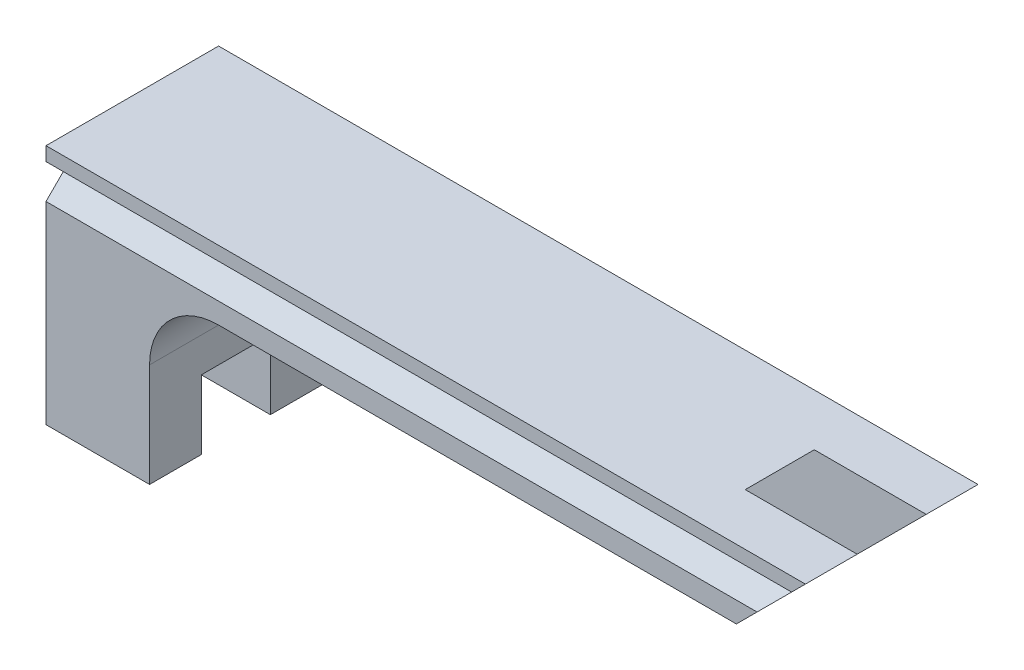
ISO-10303-21;
HEADER;
FILE_DESCRIPTION(('STEP AP214'),'2;1');
FILE_NAME('part.step','',(''),(''),'','','');
FILE_SCHEMA(('AUTOMOTIVE_DESIGN { 1 0 10303 214 1 1 1 1 }'));
ENDSEC;
DATA;
#1=APPLICATION_CONTEXT('core data for automotive mechanical design processes');
#2=APPLICATION_PROTOCOL_DEFINITION('international standard','automotive_design',2000,#1);
#3=PRODUCT_CONTEXT('',#1,'mechanical');
#4=PRODUCT('Part','Part','',(#3));
#5=PRODUCT_RELATED_PRODUCT_CATEGORY('part','',(#4));
#6=PRODUCT_DEFINITION_FORMATION('','',#4);
#7=PRODUCT_DEFINITION_CONTEXT('part definition',#1,'design');
#8=PRODUCT_DEFINITION('design','',#6,#7);
#9=PRODUCT_DEFINITION_SHAPE('','',#8);
#10=(LENGTH_UNIT() NAMED_UNIT(*) SI_UNIT(.MILLI.,.METRE.));
#11=(NAMED_UNIT(*) PLANE_ANGLE_UNIT() SI_UNIT($,.RADIAN.));
#12=(NAMED_UNIT(*) SI_UNIT($,.STERADIAN.) SOLID_ANGLE_UNIT());
#13=UNCERTAINTY_MEASURE_WITH_UNIT(LENGTH_MEASURE(1.E-05),#10,'distance_accuracy_value','');
#14=(GEOMETRIC_REPRESENTATION_CONTEXT(3) GLOBAL_UNCERTAINTY_ASSIGNED_CONTEXT((#13)) GLOBAL_UNIT_ASSIGNED_CONTEXT((#10,
#11,#12)) REPRESENTATION_CONTEXT('',''));
#15=CARTESIAN_POINT('',(0.,0.,0.));
#16=DIRECTION('',(0.,0.,1.));
#17=DIRECTION('',(1.,0.,0.));
#18=AXIS2_PLACEMENT_3D('',#15,#16,#17);
#19=CARTESIAN_POINT('',(-60.,-5.,40.));
#20=DIRECTION('',(0.,0.,1.));
#21=DIRECTION('',(1.,0.,0.));
#22=AXIS2_PLACEMENT_3D('',#19,#20,#21);
#23=PLANE('',#22);
#24=DIRECTION('',(1.,0.,0.));
#25=VECTOR('',#24,1.);
#26=CARTESIAN_POINT('',(-60.,21.,40.));
#27=LINE('',#26,#25);
#28=CARTESIAN_POINT('',(-110.,21.,40.));
#29=VERTEX_POINT('',#28);
#30=CARTESIAN_POINT('',(96.0000000000003,21.,40.));
#31=VERTEX_POINT('',#30);
#32=EDGE_CURVE('E11',#29,#31,#27,.T.);
#33=ORIENTED_EDGE('',*,*,#32,.F.);
#34=DIRECTION('',(0.,-1.,0.));
#35=VECTOR('',#34,1.);
#36=CARTESIAN_POINT('',(-110.,35.,40.));
#37=LINE('',#36,#35);
#38=CARTESIAN_POINT('',(-110.,-35.,40.));
#39=VERTEX_POINT('',#38);
#40=EDGE_CURVE('E259',#29,#39,#37,.T.);
#41=ORIENTED_EDGE('',*,*,#40,.T.);
#42=DIRECTION('',(1.,0.,0.));
#43=VECTOR('',#42,1.);
#44=CARTESIAN_POINT('',(-110.,-35.,40.));
#45=LINE('',#44,#43);
#46=CARTESIAN_POINT('',(-80.,-35.,40.));
#47=VERTEX_POINT('',#46);
#48=EDGE_CURVE('E263',#39,#47,#45,.T.);
#49=ORIENTED_EDGE('',*,*,#48,.T.);
#50=DIRECTION('',(0.,1.,0.));
#51=VECTOR('',#50,1.);
#52=CARTESIAN_POINT('',(-80.,-35.,40.));
#53=LINE('',#52,#51);
#54=CARTESIAN_POINT('',(-80.,-5.,40.));
#55=VERTEX_POINT('',#54);
#56=EDGE_CURVE('E266',#47,#55,#53,.T.);
#57=ORIENTED_EDGE('',*,*,#56,.T.);
#58=CARTESIAN_POINT('',(-60.,-5.,40.));
#59=DIRECTION('',(0.,0.,-1.));
#60=DIRECTION('',(1.,0.,0.));
#61=AXIS2_PLACEMENT_3D('',#58,#59,#60);
#62=CIRCLE('',#61,20.);
#63=CARTESIAN_POINT('',(-60.,15.,40.));
#64=VERTEX_POINT('',#63);
#65=EDGE_CURVE('E269',#55,#64,#62,.T.);
#66=ORIENTED_EDGE('',*,*,#65,.T.);
#67=DIRECTION('',(1.,0.,0.));
#68=VECTOR('',#67,1.);
#69=CARTESIAN_POINT('',(-60.,15.,40.));
#70=LINE('',#69,#68);
#71=CARTESIAN_POINT('',(90.0000000000003,15.,40.));
#72=VERTEX_POINT('',#71);
#73=EDGE_CURVE('E249',#64,#72,#70,.T.);
#74=ORIENTED_EDGE('',*,*,#73,.T.);
#75=DIRECTION('',(0.707106781186541,0.707106781186554,0.));
#76=VECTOR('',#75,1.);
#77=CARTESIAN_POINT('',(90.0000000000003,15.,40.));
#78=LINE('',#77,#76);
#79=EDGE_CURVE('E253',#72,#31,#78,.T.);
#80=ORIENTED_EDGE('',*,*,#79,.T.);
#81=EDGE_LOOP('',(#33,#41,#49,#57,#66,#74,#80));
#82=FACE_BOUND('',#81,.T.);
#83=ADVANCED_FACE('F35',(#82),#23,.T.);
#84=CARTESIAN_POINT('',(-60.,-5.,-10.));
#85=DIRECTION('',(0.,0.,-1.));
#86=DIRECTION('',(-1.,0.,0.));
#87=AXIS2_PLACEMENT_3D('',#84,#85,#86);
#88=PLANE('',#87);
#89=DIRECTION('',(1.,0.,0.));
#90=VECTOR('',#89,1.);
#91=CARTESIAN_POINT('',(-60.,31.,-10.));
#92=LINE('',#91,#90);
#93=CARTESIAN_POINT('',(-110.,31.,-10.));
#94=VERTEX_POINT('',#93);
#95=CARTESIAN_POINT('',(106.,31.,-10.));
#96=VERTEX_POINT('',#95);
#97=EDGE_CURVE('E209',#94,#96,#92,.T.);
#98=ORIENTED_EDGE('',*,*,#97,.F.);
#99=DIRECTION('',(0.,1.,0.));
#100=VECTOR('',#99,1.);
#101=CARTESIAN_POINT('',(-110.,-35.,-10.));
#102=LINE('',#101,#100);
#103=CARTESIAN_POINT('',(-110.,35.,-10.));
#104=VERTEX_POINT('',#103);
#105=EDGE_CURVE('E227',#94,#104,#102,.T.);
#106=ORIENTED_EDGE('',*,*,#105,.T.);
#107=DIRECTION('',(1.,0.,0.));
#108=VECTOR('',#107,1.);
#109=CARTESIAN_POINT('',(-110.,35.,-10.));
#110=LINE('',#109,#108);
#111=CARTESIAN_POINT('',(110.,35.,-10.));
#112=VERTEX_POINT('',#111);
#113=EDGE_CURVE('E226',#104,#112,#110,.T.);
#114=ORIENTED_EDGE('',*,*,#113,.T.);
#115=DIRECTION('',(-0.707106781186542,-0.707106781186553,0.));
#116=VECTOR('',#115,1.);
#117=CARTESIAN_POINT('',(110.,35.,-10.));
#118=LINE('',#117,#116);
#119=EDGE_CURVE('E237',#112,#96,#118,.T.);
#120=ORIENTED_EDGE('',*,*,#119,.T.);
#121=EDGE_LOOP('',(#98,#106,#114,#120));
#122=FACE_BOUND('',#121,.T.);
#123=ADVANCED_FACE('F370',(#122),#88,.T.);
#124=CARTESIAN_POINT('',(110.,77.4264068711929,5.00000000000001));
#125=DIRECTION('',(0.,0.,-1.));
#126=DIRECTION('',(0.,1.,0.));
#127=AXIS2_PLACEMENT_3D('',#124,#125,#126);
#128=PLANE('',#127);
#129=DIRECTION('',(0.707106781186552,0.707106781186544,0.));
#130=VECTOR('',#129,1.);
#131=CARTESIAN_POINT('',(115.,72.4264068711923,5.00000000000001));
#132=LINE('',#131,#130);
#133=CARTESIAN_POINT('',(57.5735931288071,15.,4.99999999999999));
#134=VERTEX_POINT('',#133);
#135=CARTESIAN_POINT('',(77.5735931288073,35.,4.99999999999999));
#136=VERTEX_POINT('',#135);
#137=EDGE_CURVE('E278',#134,#136,#132,.T.);
#138=ORIENTED_EDGE('',*,*,#137,.F.);
#139=DIRECTION('',(-1.,0.,0.));
#140=VECTOR('',#139,1.);
#141=CARTESIAN_POINT('',(-80.,15.,4.99999999999996));
#142=LINE('',#141,#140);
#143=CARTESIAN_POINT('',(90.0000000000003,15.,4.99999999999999));
#144=VERTEX_POINT('',#143);
#145=EDGE_CURVE('E290',#144,#134,#142,.T.);
#146=ORIENTED_EDGE('',*,*,#145,.F.);
#147=DIRECTION('',(-0.707106781186542,-0.707106781186553,0.));
#148=VECTOR('',#147,1.);
#149=CARTESIAN_POINT('',(110.,35.,5.));
#150=LINE('',#149,#148);
#151=CARTESIAN_POINT('',(110.,35.,5.));
#152=VERTEX_POINT('',#151);
#153=EDGE_CURVE('E344',#152,#144,#150,.T.);
#154=ORIENTED_EDGE('',*,*,#153,.F.);
#155=DIRECTION('',(1.,0.,0.));
#156=VECTOR('',#155,1.);
#157=CARTESIAN_POINT('',(-110.,35.,4.99999999999996));
#158=LINE('',#157,#156);
#159=EDGE_CURVE('E292',#136,#152,#158,.T.);
#160=ORIENTED_EDGE('',*,*,#159,.F.);
#161=EDGE_LOOP('',(#138,#146,#154,#160));
#162=FACE_BOUND('',#161,.T.);
#163=ADVANCED_FACE('F453',(#162),#128,.F.);
#164=CARTESIAN_POINT('',(110.,77.4264068711929,25.));
#165=DIRECTION('',(0.,0.,1.));
#166=DIRECTION('',(1.,0.,0.));
#167=AXIS2_PLACEMENT_3D('',#164,#165,#166);
#168=PLANE('',#167);
#169=DIRECTION('',(-0.707106781186552,-0.707106781186543,0.));
#170=VECTOR('',#169,1.);
#171=CARTESIAN_POINT('',(57.5735931288071,15.,25.));
#172=LINE('',#171,#170);
#173=CARTESIAN_POINT('',(77.5735931288073,35.,25.));
#174=VERTEX_POINT('',#173);
#175=CARTESIAN_POINT('',(57.5735931288071,15.,25.));
#176=VERTEX_POINT('',#175);
#177=EDGE_CURVE('E272',#174,#176,#172,.T.);
#178=ORIENTED_EDGE('',*,*,#177,.F.);
#179=DIRECTION('',(-1.,0.,0.));
#180=VECTOR('',#179,1.);
#181=CARTESIAN_POINT('',(-110.,35.,25.));
#182=LINE('',#181,#180);
#183=CARTESIAN_POINT('',(110.,35.,25.));
#184=VERTEX_POINT('',#183);
#185=EDGE_CURVE('E287',#184,#174,#182,.T.);
#186=ORIENTED_EDGE('',*,*,#185,.F.);
#187=DIRECTION('',(0.707106781186542,0.707106781186553,0.));
#188=VECTOR('',#187,1.);
#189=CARTESIAN_POINT('',(110.,35.,25.));
#190=LINE('',#189,#188);
#191=CARTESIAN_POINT('',(90.0000000000003,15.,25.));
#192=VERTEX_POINT('',#191);
#193=EDGE_CURVE('E341',#192,#184,#190,.T.);
#194=ORIENTED_EDGE('',*,*,#193,.F.);
#195=DIRECTION('',(1.,0.,0.));
#196=VECTOR('',#195,1.);
#197=CARTESIAN_POINT('',(-80.,15.,25.));
#198=LINE('',#197,#196);
#199=EDGE_CURVE('E284',#176,#192,#198,.T.);
#200=ORIENTED_EDGE('',*,*,#199,.F.);
#201=EDGE_LOOP('',(#178,#186,#194,#200));
#202=FACE_BOUND('',#201,.T.);
#203=ADVANCED_FACE('F471',(#202),#168,.F.);
#204=CARTESIAN_POINT('',(110.,35.,0.));
#205=DIRECTION('',(-0.707106781186553,0.707106781186542,0.));
#206=DIRECTION('',(-0.707106781186542,-0.707106781186553,0.));
#207=AXIS2_PLACEMENT_3D('',#204,#205,#206);
#208=PLANE('',#207);
#209=DIRECTION('',(0.577350269189619,0.577350269189629,0.577350269189629));
#210=VECTOR('',#209,1.);
#211=CARTESIAN_POINT('',(108.666666666667,33.6666666666666,2.66666666666666));
#212=LINE('',#211,#210);
#213=CARTESIAN_POINT('',(96.0000000000002,21.,-10.));
#214=VERTEX_POINT('',#213);
#215=CARTESIAN_POINT('',(101.,26.,-5.));
#216=VERTEX_POINT('',#215);
#217=EDGE_CURVE('E58',#214,#216,#212,.T.);
#218=ORIENTED_EDGE('',*,*,#217,.T.);
#219=DIRECTION('',(0.577350269189619,0.577350269189629,-0.577350269189629));
#220=VECTOR('',#219,1.);
#221=CARTESIAN_POINT('',(105.333333333333,30.3333333333333,-9.33333333333328));
#222=LINE('',#221,#220);
#223=EDGE_CURVE('E375',#216,#96,#222,.T.);
#224=ORIENTED_EDGE('',*,*,#223,.T.);
#225=ORIENTED_EDGE('',*,*,#119,.F.);
#226=DIRECTION('',(0.,0.,-1.));
#227=VECTOR('',#226,1.);
#228=CARTESIAN_POINT('',(110.,35.,30.));
#229=LINE('',#228,#227);
#230=EDGE_CURVE('E334',#152,#112,#229,.T.);
#231=ORIENTED_EDGE('',*,*,#230,.F.);
#232=ORIENTED_EDGE('',*,*,#153,.T.);
#233=DIRECTION('',(0.,0.,1.));
#234=VECTOR('',#233,1.);
#235=CARTESIAN_POINT('',(90.0000000000003,15.,0.));
#236=LINE('',#235,#234);
#237=CARTESIAN_POINT('',(90.0000000000003,15.,-10.));
#238=VERTEX_POINT('',#237);
#239=EDGE_CURVE('E295',#238,#144,#236,.T.);
#240=ORIENTED_EDGE('',*,*,#239,.F.);
#241=EDGE_CURVE('E230',#214,#238,#118,.T.);
#242=ORIENTED_EDGE('',*,*,#241,.F.);
#243=EDGE_LOOP('',(#218,#224,#225,#231,#232,#240,#242));
#244=FACE_BOUND('',#243,.T.);
#245=ADVANCED_FACE('F377',(#244),#208,.F.);
#246=CARTESIAN_POINT('',(-110.,-35.,30.));
#247=DIRECTION('',(0.,1.,0.));
#248=DIRECTION('',(0.,0.,1.));
#249=AXIS2_PLACEMENT_3D('',#246,#247,#248);
#250=PLANE('',#249);
#251=DIRECTION('',(0.,0.,-1.));
#252=VECTOR('',#251,1.);
#253=CARTESIAN_POINT('',(-110.,-35.,30.));
#254=LINE('',#253,#252);
#255=CARTESIAN_POINT('',(-110.,-35.,25.));
#256=VERTEX_POINT('',#255);
#257=EDGE_CURVE('E328',#39,#256,#254,.T.);
#258=ORIENTED_EDGE('',*,*,#257,.T.);
#259=DIRECTION('',(1.,0.,0.));
#260=VECTOR('',#259,1.);
#261=CARTESIAN_POINT('',(-110.,-35.,25.));
#262=LINE('',#261,#260);
#263=CARTESIAN_POINT('',(-80.,-35.,25.));
#264=VERTEX_POINT('',#263);
#265=EDGE_CURVE('E320',#256,#264,#262,.T.);
#266=ORIENTED_EDGE('',*,*,#265,.T.);
#267=DIRECTION('',(0.,0.,1.));
#268=VECTOR('',#267,1.);
#269=CARTESIAN_POINT('',(-80.,-35.,0.));
#270=LINE('',#269,#268);
#271=EDGE_CURVE('E323',#264,#47,#270,.T.);
#272=ORIENTED_EDGE('',*,*,#271,.T.);
#273=ORIENTED_EDGE('',*,*,#48,.F.);
#274=EDGE_LOOP('',(#258,#266,#272,#273));
#275=FACE_BOUND('',#274,.T.);
#276=ADVANCED_FACE('F502',(#275),#250,.F.);
#277=CARTESIAN_POINT('',(-110.,35.,30.));
#278=DIRECTION('',(0.,-1.,0.));
#279=DIRECTION('',(0.,0.,-1.));
#280=AXIS2_PLACEMENT_3D('',#277,#278,#279);
#281=PLANE('',#280);
#282=DIRECTION('',(0.,0.,1.));
#283=VECTOR('',#282,1.);
#284=CARTESIAN_POINT('',(77.5735931288074,35.,2.99999999999999));
#285=LINE('',#284,#283);
#286=EDGE_CURVE('E275',#136,#174,#285,.T.);
#287=ORIENTED_EDGE('',*,*,#286,.F.);
#288=ORIENTED_EDGE('',*,*,#159,.T.);
#289=ORIENTED_EDGE('',*,*,#230,.T.);
#290=ORIENTED_EDGE('',*,*,#113,.F.);
#291=DIRECTION('',(0.,0.,-1.));
#292=VECTOR('',#291,1.);
#293=CARTESIAN_POINT('',(-110.,35.,30.));
#294=LINE('',#293,#292);
#295=CARTESIAN_POINT('',(-110.,35.,40.));
#296=VERTEX_POINT('',#295);
#297=EDGE_CURVE('E331',#296,#104,#294,.T.);
#298=ORIENTED_EDGE('',*,*,#297,.F.);
#299=DIRECTION('',(-1.,0.,0.));
#300=VECTOR('',#299,1.);
#301=CARTESIAN_POINT('',(110.,35.,40.));
#302=LINE('',#301,#300);
#303=CARTESIAN_POINT('',(110.,35.,40.));
#304=VERTEX_POINT('',#303);
#305=EDGE_CURVE('E256',#304,#296,#302,.T.);
#306=ORIENTED_EDGE('',*,*,#305,.F.);
#307=EDGE_CURVE('E335',#304,#184,#229,.T.);
#308=ORIENTED_EDGE('',*,*,#307,.T.);
#309=ORIENTED_EDGE('',*,*,#185,.T.);
#310=EDGE_LOOP('',(#287,#288,#289,#290,#298,#306,#308,#309));
#311=FACE_BOUND('',#310,.T.);
#312=ADVANCED_FACE('F366',(#311),#281,.F.);
#313=CARTESIAN_POINT('',(-110.,35.,30.));
#314=DIRECTION('',(1.,0.,0.));
#315=DIRECTION('',(0.,0.,-1.));
#316=AXIS2_PLACEMENT_3D('',#313,#314,#315);
#317=PLANE('',#316);
#318=ORIENTED_EDGE('',*,*,#105,.F.);
#319=DIRECTION('',(0.,0.707106781186548,-0.707106781186548));
#320=VECTOR('',#319,1.);
#321=CARTESIAN_POINT('',(-110.,31.,-10.));
#322=LINE('',#321,#320);
#323=CARTESIAN_POINT('',(-110.,26.,-5.));
#324=VERTEX_POINT('',#323);
#325=EDGE_CURVE('E218',#324,#94,#322,.T.);
#326=ORIENTED_EDGE('',*,*,#325,.F.);
#327=DIRECTION('',(0.,0.707106781186547,0.707106781186548));
#328=VECTOR('',#327,1.);
#329=CARTESIAN_POINT('',(-110.,26.,-5.));
#330=LINE('',#329,#328);
#331=CARTESIAN_POINT('',(-110.,21.,-10.));
#332=VERTEX_POINT('',#331);
#333=EDGE_CURVE('E204',#332,#324,#330,.T.);
#334=ORIENTED_EDGE('',*,*,#333,.F.);
#335=CARTESIAN_POINT('',(-110.,-35.,-10.));
#336=VERTEX_POINT('',#335);
#337=EDGE_CURVE('E217',#336,#332,#102,.T.);
#338=ORIENTED_EDGE('',*,*,#337,.F.);
#339=CARTESIAN_POINT('',(-110.,-35.,5.));
#340=VERTEX_POINT('',#339);
#341=EDGE_CURVE('E327',#340,#336,#254,.T.);
#342=ORIENTED_EDGE('',*,*,#341,.F.);
#343=DIRECTION('',(0.,1.,0.));
#344=VECTOR('',#343,1.);
#345=CARTESIAN_POINT('',(-110.,-55.,5.));
#346=LINE('',#345,#344);
#347=CARTESIAN_POINT('',(-110.,-15.,5.));
#348=VERTEX_POINT('',#347);
#349=EDGE_CURVE('E302',#340,#348,#346,.T.);
#350=ORIENTED_EDGE('',*,*,#349,.T.);
#351=DIRECTION('',(0.,0.,1.));
#352=VECTOR('',#351,1.);
#353=CARTESIAN_POINT('',(-110.,-15.,5.));
#354=LINE('',#353,#352);
#355=CARTESIAN_POINT('',(-110.,-15.,25.));
#356=VERTEX_POINT('',#355);
#357=EDGE_CURVE('E306',#348,#356,#354,.T.);
#358=ORIENTED_EDGE('',*,*,#357,.T.);
#359=DIRECTION('',(0.,-1.,0.));
#360=VECTOR('',#359,1.);
#361=CARTESIAN_POINT('',(-110.,-55.,25.));
#362=LINE('',#361,#360);
#363=EDGE_CURVE('E299',#356,#256,#362,.T.);
#364=ORIENTED_EDGE('',*,*,#363,.T.);
#365=ORIENTED_EDGE('',*,*,#257,.F.);
#366=ORIENTED_EDGE('',*,*,#40,.F.);
#367=DIRECTION('',(0.,-0.707106781186547,0.707106781186548));
#368=VECTOR('',#367,1.);
#369=CARTESIAN_POINT('',(-110.,26.,35.));
#370=LINE('',#369,#368);
#371=CARTESIAN_POINT('',(-110.,26.,35.));
#372=VERTEX_POINT('',#371);
#373=EDGE_CURVE('E359',#372,#29,#370,.T.);
#374=ORIENTED_EDGE('',*,*,#373,.F.);
#375=DIRECTION('',(0.,-0.707106781186546,-0.707106781186548));
#376=VECTOR('',#375,1.);
#377=CARTESIAN_POINT('',(-110.,31.,40.));
#378=LINE('',#377,#376);
#379=CARTESIAN_POINT('',(-110.,31.,40.));
#380=VERTEX_POINT('',#379);
#381=EDGE_CURVE('E353',#380,#372,#378,.T.);
#382=ORIENTED_EDGE('',*,*,#381,.F.);
#383=EDGE_CURVE('E260',#296,#380,#37,.T.);
#384=ORIENTED_EDGE('',*,*,#383,.F.);
#385=ORIENTED_EDGE('',*,*,#297,.T.);
#386=EDGE_LOOP('',(#318,#326,#334,#338,#342,#350,#358,#364,#365,#366,#374,#382,#384,#385));
#387=FACE_BOUND('',#386,.T.);
#388=ADVANCED_FACE('F215',(#387),#317,.F.);
#389=CARTESIAN_POINT('',(-80.,-35.,-10.));
#390=VERTEX_POINT('',#389);
#391=CARTESIAN_POINT('',(-80.,-35.,5.));
#392=VERTEX_POINT('',#391);
#393=EDGE_CURVE('E324',#390,#392,#270,.T.);
#394=ORIENTED_EDGE('',*,*,#393,.T.);
#395=DIRECTION('',(-1.,0.,0.));
#396=VECTOR('',#395,1.);
#397=CARTESIAN_POINT('',(-110.,-35.,5.));
#398=LINE('',#397,#396);
#399=EDGE_CURVE('E315',#392,#340,#398,.T.);
#400=ORIENTED_EDGE('',*,*,#399,.T.);
#401=ORIENTED_EDGE('',*,*,#341,.T.);
#402=DIRECTION('',(-1.,0.,0.));
#403=VECTOR('',#402,1.);
#404=CARTESIAN_POINT('',(-80.,-35.,-10.));
#405=LINE('',#404,#403);
#406=EDGE_CURVE('E225',#390,#336,#405,.T.);
#407=ORIENTED_EDGE('',*,*,#406,.F.);
#408=EDGE_LOOP('',(#394,#400,#401,#407));
#409=FACE_BOUND('',#408,.T.);
#410=ADVANCED_FACE('F497',(#409),#250,.F.);
#411=CARTESIAN_POINT('',(-80.,-35.,0.));
#412=DIRECTION('',(-1.,0.,0.));
#413=DIRECTION('',(0.,0.,1.));
#414=AXIS2_PLACEMENT_3D('',#411,#412,#413);
#415=PLANE('',#414);
#416=ORIENTED_EDGE('',*,*,#393,.F.);
#417=DIRECTION('',(0.,-1.,0.));
#418=VECTOR('',#417,1.);
#419=CARTESIAN_POINT('',(-80.,-5.,-10.));
#420=LINE('',#419,#418);
#421=CARTESIAN_POINT('',(-80.,-5.,-10.));
#422=VERTEX_POINT('',#421);
#423=EDGE_CURVE('E246',#422,#390,#420,.T.);
#424=ORIENTED_EDGE('',*,*,#423,.F.);
#425=DIRECTION('',(0.,0.,1.));
#426=VECTOR('',#425,1.);
#427=CARTESIAN_POINT('',(-80.,-5.,30.));
#428=LINE('',#427,#426);
#429=EDGE_CURVE('E347',#422,#55,#428,.T.);
#430=ORIENTED_EDGE('',*,*,#429,.T.);
#431=ORIENTED_EDGE('',*,*,#56,.F.);
#432=ORIENTED_EDGE('',*,*,#271,.F.);
#433=DIRECTION('',(0.,-1.,0.));
#434=VECTOR('',#433,1.);
#435=CARTESIAN_POINT('',(-80.,-55.,25.));
#436=LINE('',#435,#434);
#437=CARTESIAN_POINT('',(-80.,-15.,25.));
#438=VERTEX_POINT('',#437);
#439=EDGE_CURVE('E298',#438,#264,#436,.T.);
#440=ORIENTED_EDGE('',*,*,#439,.F.);
#441=DIRECTION('',(0.,0.,1.));
#442=VECTOR('',#441,1.);
#443=CARTESIAN_POINT('',(-80.,-15.,5.));
#444=LINE('',#443,#442);
#445=CARTESIAN_POINT('',(-80.,-15.,5.));
#446=VERTEX_POINT('',#445);
#447=EDGE_CURVE('E303',#446,#438,#444,.T.);
#448=ORIENTED_EDGE('',*,*,#447,.F.);
#449=DIRECTION('',(0.,-1.,0.));
#450=VECTOR('',#449,1.);
#451=CARTESIAN_POINT('',(-80.,-35.,5.));
#452=LINE('',#451,#450);
#453=EDGE_CURVE('E338',#446,#392,#452,.T.);
#454=ORIENTED_EDGE('',*,*,#453,.T.);
#455=EDGE_LOOP('',(#416,#424,#430,#431,#432,#440,#448,#454));
#456=FACE_BOUND('',#455,.T.);
#457=ADVANCED_FACE('F494',(#456),#415,.F.);
#458=CARTESIAN_POINT('',(-80.,15.,0.));
#459=DIRECTION('',(0.,1.,0.));
#460=DIRECTION('',(-1.,0.,0.));
#461=AXIS2_PLACEMENT_3D('',#458,#459,#460);
#462=PLANE('',#461);
#463=DIRECTION('',(1.,0.,0.));
#464=VECTOR('',#463,1.);
#465=CARTESIAN_POINT('',(-47.5,15.,5.));
#466=LINE('',#465,#464);
#467=CARTESIAN_POINT('',(-47.5,15.,5.));
#468=VERTEX_POINT('',#467);
#469=CARTESIAN_POINT('',(37.5,15.,5.));
#470=VERTEX_POINT('',#469);
#471=EDGE_CURVE('E403',#468,#470,#466,.T.);
#472=ORIENTED_EDGE('',*,*,#471,.F.);
#473=CARTESIAN_POINT('',(-47.5,15.,15.));
#474=DIRECTION('',(0.,-1.,0.));
#475=DIRECTION('',(1.,0.,0.));
#476=AXIS2_PLACEMENT_3D('',#473,#474,#475);
#477=CIRCLE('',#476,10.);
#478=CARTESIAN_POINT('',(-47.5,15.,25.));
#479=VERTEX_POINT('',#478);
#480=EDGE_CURVE('E388',#479,#468,#477,.T.);
#481=ORIENTED_EDGE('',*,*,#480,.F.);
#482=DIRECTION('',(-1.,0.,0.));
#483=VECTOR('',#482,1.);
#484=CARTESIAN_POINT('',(-47.5,15.,25.));
#485=LINE('',#484,#483);
#486=CARTESIAN_POINT('',(37.5,15.,25.));
#487=VERTEX_POINT('',#486);
#488=EDGE_CURVE('E393',#487,#479,#485,.T.);
#489=ORIENTED_EDGE('',*,*,#488,.F.);
#490=CARTESIAN_POINT('',(37.5,15.,15.));
#491=DIRECTION('',(0.,-1.,0.));
#492=DIRECTION('',(1.,0.,0.));
#493=AXIS2_PLACEMENT_3D('',#490,#491,#492);
#494=CIRCLE('',#493,10.);
#495=EDGE_CURVE('E406',#470,#487,#494,.T.);
#496=ORIENTED_EDGE('',*,*,#495,.F.);
#497=EDGE_LOOP('',(#472,#481,#489,#496));
#498=FACE_BOUND('',#497,.T.);
#499=ORIENTED_EDGE('',*,*,#145,.T.);
#500=DIRECTION('',(0.,0.,-1.));
#501=VECTOR('',#500,1.);
#502=CARTESIAN_POINT('',(57.5735931288071,15.,25.));
#503=LINE('',#502,#501);
#504=EDGE_CURVE('E281',#176,#134,#503,.T.);
#505=ORIENTED_EDGE('',*,*,#504,.F.);
#506=ORIENTED_EDGE('',*,*,#199,.T.);
#507=EDGE_CURVE('E294',#192,#72,#236,.T.);
#508=ORIENTED_EDGE('',*,*,#507,.T.);
#509=ORIENTED_EDGE('',*,*,#73,.F.);
#510=DIRECTION('',(0.,0.,1.));
#511=VECTOR('',#510,1.);
#512=CARTESIAN_POINT('',(-60.,15.,0.));
#513=LINE('',#512,#511);
#514=CARTESIAN_POINT('',(-60.,15.,-10.));
#515=VERTEX_POINT('',#514);
#516=EDGE_CURVE('E210',#64,#515,#513,.F.);
#517=ORIENTED_EDGE('',*,*,#516,.T.);
#518=DIRECTION('',(-1.,0.,0.));
#519=VECTOR('',#518,1.);
#520=CARTESIAN_POINT('',(90.0000000000003,15.,-10.));
#521=LINE('',#520,#519);
#522=EDGE_CURVE('E240',#238,#515,#521,.T.);
#523=ORIENTED_EDGE('',*,*,#522,.F.);
#524=ORIENTED_EDGE('',*,*,#239,.T.);
#525=EDGE_LOOP('',(#499,#505,#506,#508,#509,#517,#523,#524));
#526=FACE_BOUND('',#525,.T.);
#527=ADVANCED_FACE('F426',(#498,#526),#462,.F.);
#528=CARTESIAN_POINT('',(-110.,-55.,25.));
#529=DIRECTION('',(0.,0.,1.));
#530=DIRECTION('',(1.,0.,0.));
#531=AXIS2_PLACEMENT_3D('',#528,#529,#530);
#532=PLANE('',#531);
#533=ORIENTED_EDGE('',*,*,#363,.F.);
#534=DIRECTION('',(1.,0.,0.));
#535=VECTOR('',#534,1.);
#536=CARTESIAN_POINT('',(-110.,-15.,25.));
#537=LINE('',#536,#535);
#538=EDGE_CURVE('E313',#356,#438,#537,.T.);
#539=ORIENTED_EDGE('',*,*,#538,.T.);
#540=ORIENTED_EDGE('',*,*,#439,.T.);
#541=ORIENTED_EDGE('',*,*,#265,.F.);
#542=EDGE_LOOP('',(#533,#539,#540,#541));
#543=FACE_BOUND('',#542,.T.);
#544=ADVANCED_FACE('F487',(#543),#532,.F.);
#545=CARTESIAN_POINT('',(-110.,-55.,5.));
#546=DIRECTION('',(0.,0.,-1.));
#547=DIRECTION('',(-1.,0.,0.));
#548=AXIS2_PLACEMENT_3D('',#545,#546,#547);
#549=PLANE('',#548);
#550=ORIENTED_EDGE('',*,*,#453,.F.);
#551=DIRECTION('',(1.,0.,0.));
#552=VECTOR('',#551,1.);
#553=CARTESIAN_POINT('',(-110.,-15.,5.));
#554=LINE('',#553,#552);
#555=EDGE_CURVE('E309',#348,#446,#554,.T.);
#556=ORIENTED_EDGE('',*,*,#555,.F.);
#557=ORIENTED_EDGE('',*,*,#349,.F.);
#558=ORIENTED_EDGE('',*,*,#399,.F.);
#559=EDGE_LOOP('',(#550,#556,#557,#558));
#560=FACE_BOUND('',#559,.T.);
#561=ADVANCED_FACE('F483',(#560),#549,.F.);
#562=CARTESIAN_POINT('',(-110.,-15.,5.));
#563=DIRECTION('',(0.,1.,0.));
#564=DIRECTION('',(0.,0.,1.));
#565=AXIS2_PLACEMENT_3D('',#562,#563,#564);
#566=PLANE('',#565);
#567=ORIENTED_EDGE('',*,*,#447,.T.);
#568=ORIENTED_EDGE('',*,*,#538,.F.);
#569=ORIENTED_EDGE('',*,*,#357,.F.);
#570=ORIENTED_EDGE('',*,*,#555,.T.);
#571=EDGE_LOOP('',(#567,#568,#569,#570));
#572=FACE_BOUND('',#571,.T.);
#573=ADVANCED_FACE('F479',(#572),#566,.F.);
#574=DIRECTION('',(-0.577350269189619,-0.577350269189629,-0.57735026918963));
#575=VECTOR('',#574,1.);
#576=CARTESIAN_POINT('',(95.3333333333334,20.3333333333331,29.3333333333331));
#577=LINE('',#576,#575);
#578=CARTESIAN_POINT('',(106.,31.,40.));
#579=VERTEX_POINT('',#578);
#580=CARTESIAN_POINT('',(101.,26.,35.));
#581=VERTEX_POINT('',#580);
#582=EDGE_CURVE('E50',#579,#581,#577,.T.);
#583=ORIENTED_EDGE('',*,*,#582,.T.);
#584=DIRECTION('',(-0.577350269189619,-0.577350269189629,0.57735026918963));
#585=VECTOR('',#584,1.);
#586=CARTESIAN_POINT('',(118.666666666667,43.6666666666668,17.3333333333332));
#587=LINE('',#586,#585);
#588=EDGE_CURVE('E380',#581,#31,#587,.T.);
#589=ORIENTED_EDGE('',*,*,#588,.T.);
#590=ORIENTED_EDGE('',*,*,#79,.F.);
#591=ORIENTED_EDGE('',*,*,#507,.F.);
#592=ORIENTED_EDGE('',*,*,#193,.T.);
#593=ORIENTED_EDGE('',*,*,#307,.F.);
#594=EDGE_CURVE('E252',#579,#304,#78,.T.);
#595=ORIENTED_EDGE('',*,*,#594,.F.);
#596=EDGE_LOOP('',(#583,#589,#590,#591,#592,#593,#595));
#597=FACE_BOUND('',#596,.T.);
#598=ADVANCED_FACE('F468',(#597),#208,.F.);
#599=CARTESIAN_POINT('',(-60.,-5.,0.));
#600=DIRECTION('',(0.,0.,-1.));
#601=DIRECTION('',(-1.,0.,0.));
#602=AXIS2_PLACEMENT_3D('',#599,#600,#601);
#603=CYLINDRICAL_SURFACE('',#602,20.);
#604=ORIENTED_EDGE('',*,*,#429,.F.);
#605=CARTESIAN_POINT('',(-60.,-5.,-10.));
#606=DIRECTION('',(0.,0.,1.));
#607=DIRECTION('',(-1.,0.,0.));
#608=AXIS2_PLACEMENT_3D('',#605,#606,#607);
#609=CIRCLE('',#608,20.);
#610=EDGE_CURVE('E243',#515,#422,#609,.T.);
#611=ORIENTED_EDGE('',*,*,#610,.F.);
#612=ORIENTED_EDGE('',*,*,#516,.F.);
#613=ORIENTED_EDGE('',*,*,#65,.F.);
#614=EDGE_LOOP('',(#604,#611,#612,#613));
#615=FACE_BOUND('',#614,.T.);
#616=ADVANCED_FACE('F37',(#615),#603,.F.);
#617=CARTESIAN_POINT('',(57.5735931288071,15.,2.99999999999999));
#618=DIRECTION('',(-0.707106781186544,0.707106781186552,0.));
#619=DIRECTION('',(-0.707106781186552,-0.707106781186544,0.));
#620=AXIS2_PLACEMENT_3D('',#617,#618,#619);
#621=PLANE('',#620);
#622=ORIENTED_EDGE('',*,*,#504,.T.);
#623=ORIENTED_EDGE('',*,*,#137,.T.);
#624=ORIENTED_EDGE('',*,*,#286,.T.);
#625=ORIENTED_EDGE('',*,*,#177,.T.);
#626=EDGE_LOOP('',(#622,#623,#624,#625));
#627=FACE_BOUND('',#626,.T.);
#628=ADVANCED_FACE('F457',(#627),#621,.F.);
#629=DIRECTION('',(-1.,0.,0.));
#630=VECTOR('',#629,1.);
#631=CARTESIAN_POINT('',(-60.,31.,40.));
#632=LINE('',#631,#630);
#633=EDGE_CURVE('E43',#579,#380,#632,.T.);
#634=ORIENTED_EDGE('',*,*,#633,.F.);
#635=ORIENTED_EDGE('',*,*,#594,.T.);
#636=ORIENTED_EDGE('',*,*,#305,.T.);
#637=ORIENTED_EDGE('',*,*,#383,.T.);
#638=EDGE_LOOP('',(#634,#635,#636,#637));
#639=FACE_BOUND('',#638,.T.);
#640=ADVANCED_FACE('F361',(#639),#23,.T.);
#641=DIRECTION('',(-1.,0.,0.));
#642=VECTOR('',#641,1.);
#643=CARTESIAN_POINT('',(-60.,21.,-10.));
#644=LINE('',#643,#642);
#645=EDGE_CURVE('E201',#214,#332,#644,.T.);
#646=ORIENTED_EDGE('',*,*,#645,.F.);
#647=ORIENTED_EDGE('',*,*,#241,.T.);
#648=ORIENTED_EDGE('',*,*,#522,.T.);
#649=ORIENTED_EDGE('',*,*,#610,.T.);
#650=ORIENTED_EDGE('',*,*,#423,.T.);
#651=ORIENTED_EDGE('',*,*,#406,.T.);
#652=ORIENTED_EDGE('',*,*,#337,.T.);
#653=EDGE_LOOP('',(#646,#647,#648,#649,#650,#651,#652));
#654=FACE_BOUND('',#653,.T.);
#655=ADVANCED_FACE('F222',(#654),#88,.T.);
#656=CARTESIAN_POINT('',(-47.5,25.,15.));
#657=DIRECTION('',(0.,-1.,0.));
#658=DIRECTION('',(1.,0.,0.));
#659=AXIS2_PLACEMENT_3D('',#656,#657,#658);
#660=CYLINDRICAL_SURFACE('',#659,10.);
#661=ORIENTED_EDGE('',*,*,#480,.T.);
#662=DIRECTION('',(0.,-1.,0.));
#663=VECTOR('',#662,1.);
#664=CARTESIAN_POINT('',(-47.5,25.,5.));
#665=LINE('',#664,#663);
#666=CARTESIAN_POINT('',(-47.5,25.,5.));
#667=VERTEX_POINT('',#666);
#668=EDGE_CURVE('E234',#667,#468,#665,.T.);
#669=ORIENTED_EDGE('',*,*,#668,.F.);
#670=CARTESIAN_POINT('',(-47.5,25.,15.));
#671=DIRECTION('',(0.,-1.,0.));
#672=DIRECTION('',(1.,0.,0.));
#673=AXIS2_PLACEMENT_3D('',#670,#671,#672);
#674=CIRCLE('',#673,10.);
#675=CARTESIAN_POINT('',(-47.5,25.,25.));
#676=VERTEX_POINT('',#675);
#677=EDGE_CURVE('E389',#676,#667,#674,.T.);
#678=ORIENTED_EDGE('',*,*,#677,.F.);
#679=DIRECTION('',(0.,-1.,0.));
#680=VECTOR('',#679,1.);
#681=CARTESIAN_POINT('',(-47.5,25.,25.));
#682=LINE('',#681,#680);
#683=EDGE_CURVE('E232',#676,#479,#682,.T.);
#684=ORIENTED_EDGE('',*,*,#683,.T.);
#685=EDGE_LOOP('',(#661,#669,#678,#684));
#686=FACE_BOUND('',#685,.T.);
#687=ADVANCED_FACE('F435',(#686),#660,.F.);
#688=CARTESIAN_POINT('',(-47.5,25.,25.));
#689=DIRECTION('',(0.,0.,1.));
#690=DIRECTION('',(1.,0.,0.));
#691=AXIS2_PLACEMENT_3D('',#688,#689,#690);
#692=PLANE('',#691);
#693=ORIENTED_EDGE('',*,*,#488,.T.);
#694=ORIENTED_EDGE('',*,*,#683,.F.);
#695=DIRECTION('',(-1.,0.,0.));
#696=VECTOR('',#695,1.);
#697=CARTESIAN_POINT('',(-47.5,25.,25.));
#698=LINE('',#697,#696);
#699=CARTESIAN_POINT('',(37.5,25.,25.));
#700=VERTEX_POINT('',#699);
#701=EDGE_CURVE('E399',#700,#676,#698,.T.);
#702=ORIENTED_EDGE('',*,*,#701,.F.);
#703=DIRECTION('',(0.,-1.,0.));
#704=VECTOR('',#703,1.);
#705=CARTESIAN_POINT('',(37.5,25.,25.));
#706=LINE('',#705,#704);
#707=EDGE_CURVE('E412',#700,#487,#706,.T.);
#708=ORIENTED_EDGE('',*,*,#707,.T.);
#709=EDGE_LOOP('',(#693,#694,#702,#708));
#710=FACE_BOUND('',#709,.T.);
#711=ADVANCED_FACE('F434',(#710),#692,.F.);
#712=CARTESIAN_POINT('',(37.5,25.,15.));
#713=DIRECTION('',(0.,-1.,0.));
#714=DIRECTION('',(1.,0.,0.));
#715=AXIS2_PLACEMENT_3D('',#712,#713,#714);
#716=CYLINDRICAL_SURFACE('',#715,10.);
#717=ORIENTED_EDGE('',*,*,#495,.T.);
#718=ORIENTED_EDGE('',*,*,#707,.F.);
#719=CARTESIAN_POINT('',(37.5,25.,15.));
#720=DIRECTION('',(0.,-1.,0.));
#721=DIRECTION('',(1.,0.,0.));
#722=AXIS2_PLACEMENT_3D('',#719,#720,#721);
#723=CIRCLE('',#722,10.);
#724=CARTESIAN_POINT('',(37.5,25.,5.));
#725=VERTEX_POINT('',#724);
#726=EDGE_CURVE('E396',#725,#700,#723,.T.);
#727=ORIENTED_EDGE('',*,*,#726,.F.);
#728=DIRECTION('',(0.,-1.,0.));
#729=VECTOR('',#728,1.);
#730=CARTESIAN_POINT('',(37.5,25.,5.));
#731=LINE('',#730,#729);
#732=EDGE_CURVE('E413',#725,#470,#731,.T.);
#733=ORIENTED_EDGE('',*,*,#732,.T.);
#734=EDGE_LOOP('',(#717,#718,#727,#733));
#735=FACE_BOUND('',#734,.T.);
#736=ADVANCED_FACE('F429',(#735),#716,.F.);
#737=CARTESIAN_POINT('',(-47.5,25.,5.));
#738=DIRECTION('',(0.,0.,-1.));
#739=DIRECTION('',(-1.,0.,0.));
#740=AXIS2_PLACEMENT_3D('',#737,#738,#739);
#741=PLANE('',#740);
#742=ORIENTED_EDGE('',*,*,#471,.T.);
#743=ORIENTED_EDGE('',*,*,#732,.F.);
#744=DIRECTION('',(1.,0.,0.));
#745=VECTOR('',#744,1.);
#746=CARTESIAN_POINT('',(-47.5,25.,5.));
#747=LINE('',#746,#745);
#748=EDGE_CURVE('E392',#667,#725,#747,.T.);
#749=ORIENTED_EDGE('',*,*,#748,.F.);
#750=ORIENTED_EDGE('',*,*,#668,.T.);
#751=EDGE_LOOP('',(#742,#743,#749,#750));
#752=FACE_BOUND('',#751,.T.);
#753=ADVANCED_FACE('F420',(#752),#741,.F.);
#754=CARTESIAN_POINT('',(-47.5,25.,15.));
#755=DIRECTION('',(0.,-1.,0.));
#756=DIRECTION('',(1.,0.,0.));
#757=AXIS2_PLACEMENT_3D('',#754,#755,#756);
#758=PLANE('',#757);
#759=ORIENTED_EDGE('',*,*,#677,.T.);
#760=ORIENTED_EDGE('',*,*,#748,.T.);
#761=ORIENTED_EDGE('',*,*,#726,.T.);
#762=ORIENTED_EDGE('',*,*,#701,.T.);
#763=EDGE_LOOP('',(#759,#760,#761,#762));
#764=FACE_BOUND('',#763,.T.);
#765=ADVANCED_FACE('F433',(#764),#758,.T.);
#766=CARTESIAN_POINT('',(189.,31.,-10.));
#767=DIRECTION('',(0.,0.707106781186548,0.707106781186548));
#768=DIRECTION('',(0.,-0.707106781186548,0.707106781186548));
#769=AXIS2_PLACEMENT_3D('',#766,#767,#768);
#770=PLANE('',#769);
#771=DIRECTION('',(-1.,0.,0.));
#772=VECTOR('',#771,1.);
#773=CARTESIAN_POINT('',(189.,26.,-5.));
#774=LINE('',#773,#772);
#775=EDGE_CURVE('E382',#216,#324,#774,.T.);
#776=ORIENTED_EDGE('',*,*,#775,.T.);
#777=ORIENTED_EDGE('',*,*,#325,.T.);
#778=ORIENTED_EDGE('',*,*,#97,.T.);
#779=ORIENTED_EDGE('',*,*,#223,.F.);
#780=EDGE_LOOP('',(#776,#777,#778,#779));
#781=FACE_BOUND('',#780,.T.);
#782=ADVANCED_FACE('F374',(#781),#770,.F.);
#783=CARTESIAN_POINT('',(189.,26.,-5.));
#784=DIRECTION('',(0.,-0.707106781186548,0.707106781186547));
#785=DIRECTION('',(0.,-0.707106781186547,-0.707106781186548));
#786=AXIS2_PLACEMENT_3D('',#783,#784,#785);
#787=PLANE('',#786);
#788=ORIENTED_EDGE('',*,*,#645,.T.);
#789=ORIENTED_EDGE('',*,*,#333,.T.);
#790=ORIENTED_EDGE('',*,*,#775,.F.);
#791=ORIENTED_EDGE('',*,*,#217,.F.);
#792=EDGE_LOOP('',(#788,#789,#790,#791));
#793=FACE_BOUND('',#792,.T.);
#794=ADVANCED_FACE('F203',(#793),#787,.F.);
#795=CARTESIAN_POINT('',(189.,26.,35.));
#796=DIRECTION('',(0.,-0.707106781186548,-0.707106781186547));
#797=DIRECTION('',(0.,0.707106781186547,-0.707106781186548));
#798=AXIS2_PLACEMENT_3D('',#795,#796,#797);
#799=PLANE('',#798);
#800=DIRECTION('',(-1.,0.,0.));
#801=VECTOR('',#800,1.);
#802=CARTESIAN_POINT('',(189.,26.,35.));
#803=LINE('',#802,#801);
#804=EDGE_CURVE('E219',#581,#372,#803,.T.);
#805=ORIENTED_EDGE('',*,*,#804,.T.);
#806=ORIENTED_EDGE('',*,*,#373,.T.);
#807=ORIENTED_EDGE('',*,*,#32,.T.);
#808=ORIENTED_EDGE('',*,*,#588,.F.);
#809=EDGE_LOOP('',(#805,#806,#807,#808));
#810=FACE_BOUND('',#809,.T.);
#811=ADVANCED_FACE('F524',(#810),#799,.F.);
#812=CARTESIAN_POINT('',(189.,31.,40.));
#813=DIRECTION('',(0.,0.707106781186549,-0.707106781186547));
#814=DIRECTION('',(0.,0.707106781186547,0.707106781186549));
#815=AXIS2_PLACEMENT_3D('',#812,#813,#814);
#816=PLANE('',#815);
#817=ORIENTED_EDGE('',*,*,#633,.T.);
#818=ORIENTED_EDGE('',*,*,#381,.T.);
#819=ORIENTED_EDGE('',*,*,#804,.F.);
#820=ORIENTED_EDGE('',*,*,#582,.F.);
#821=EDGE_LOOP('',(#817,#818,#819,#820));
#822=FACE_BOUND('',#821,.T.);
#823=ADVANCED_FACE('F352',(#822),#816,.F.);
#824=CLOSED_SHELL('',(#83,#123,#163,#203,#245,#276,#312,#388,#410,#457,#527,#544,#561,#573,#598,
#616,#628,#640,#655,#687,#711,#736,#753,#765,#782,#794,#811,#823));
#825=MANIFOLD_SOLID_BREP('B2',#824);
#826=ADVANCED_BREP_SHAPE_REPRESENTATION('',(#18,#825),#14);
#827=SHAPE_DEFINITION_REPRESENTATION(#9,#826);
ENDSEC;
END-ISO-10303-21;
